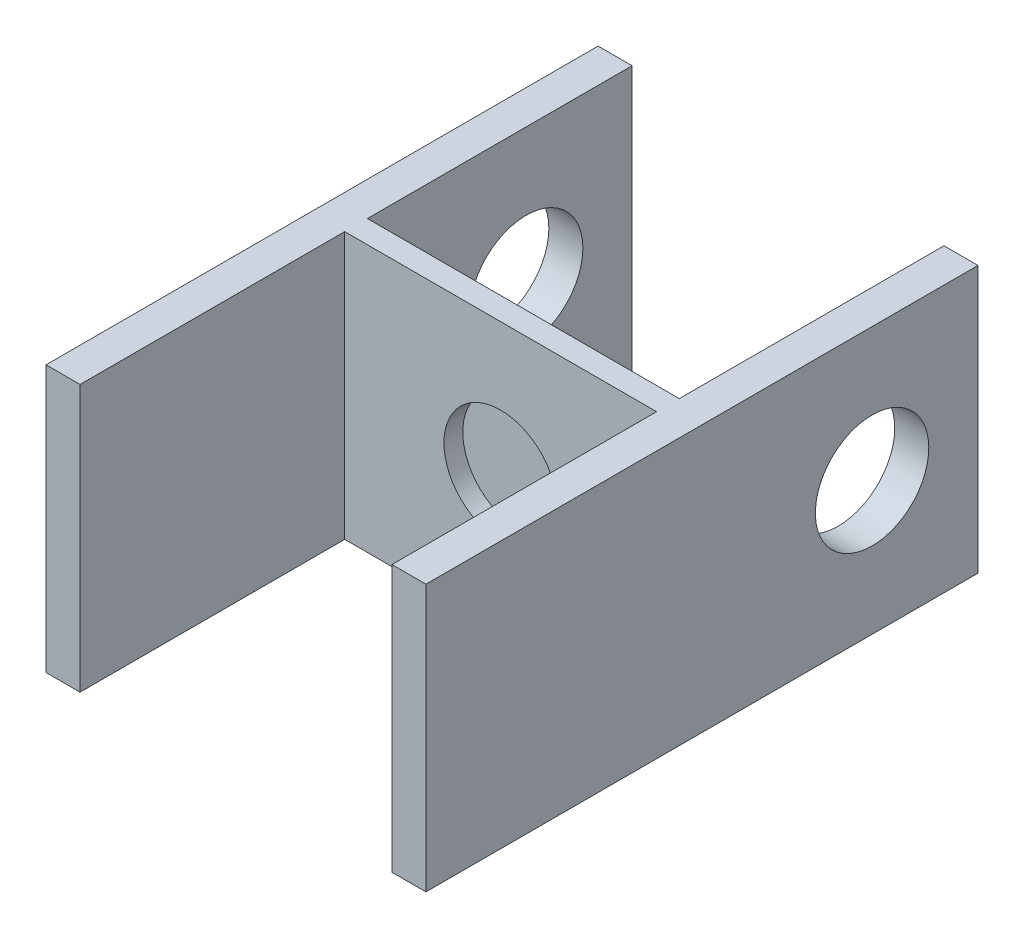
ISO-10303-21;
HEADER;
FILE_DESCRIPTION(('STEP AP214'),'2;1');
FILE_NAME('part.step','',(''),(''),'','','');
FILE_SCHEMA(('AUTOMOTIVE_DESIGN { 1 0 10303 214 1 1 1 1 }'));
ENDSEC;
DATA;
#1=APPLICATION_CONTEXT('core data for automotive mechanical design processes');
#2=APPLICATION_PROTOCOL_DEFINITION('international standard','automotive_design',2000,#1);
#3=PRODUCT_CONTEXT('',#1,'mechanical');
#4=PRODUCT('Part','Part','',(#3));
#5=PRODUCT_RELATED_PRODUCT_CATEGORY('part','',(#4));
#6=PRODUCT_DEFINITION_FORMATION('','',#4);
#7=PRODUCT_DEFINITION_CONTEXT('part definition',#1,'design');
#8=PRODUCT_DEFINITION('design','',#6,#7);
#9=PRODUCT_DEFINITION_SHAPE('','',#8);
#10=(LENGTH_UNIT() NAMED_UNIT(*) SI_UNIT(.MILLI.,.METRE.));
#11=(NAMED_UNIT(*) PLANE_ANGLE_UNIT() SI_UNIT($,.RADIAN.));
#12=(NAMED_UNIT(*) SI_UNIT($,.STERADIAN.) SOLID_ANGLE_UNIT());
#13=UNCERTAINTY_MEASURE_WITH_UNIT(LENGTH_MEASURE(1.E-05),#10,'distance_accuracy_value','');
#14=(GEOMETRIC_REPRESENTATION_CONTEXT(3) GLOBAL_UNCERTAINTY_ASSIGNED_CONTEXT((#13)) GLOBAL_UNIT_ASSIGNED_CONTEXT((#10,
#11,#12)) REPRESENTATION_CONTEXT('',''));
#15=CARTESIAN_POINT('',(0.,0.,0.));
#16=DIRECTION('',(0.,0.,1.));
#17=DIRECTION('',(1.,0.,0.));
#18=AXIS2_PLACEMENT_3D('',#15,#16,#17);
#19=CARTESIAN_POINT('',(-103.125,205.625,-180.218220147143));
#20=DIRECTION('',(0.,0.,1.));
#21=DIRECTION('',(1.,0.,0.));
#22=AXIS2_PLACEMENT_3D('',#19,#20,#21);
#23=PLANE('',#22);
#24=DIRECTION('',(-1.,0.,0.));
#25=VECTOR('',#24,1.);
#26=CARTESIAN_POINT('',(-103.125,29.375,-180.218220147143));
#27=LINE('',#26,#25);
#28=CARTESIAN_POINT('',(-103.125,29.375,-180.218220147143));
#29=VERTEX_POINT('',#28);
#30=CARTESIAN_POINT('',(-125.625,29.375,-180.218220147143));
#31=VERTEX_POINT('',#30);
#32=EDGE_CURVE('E166',#29,#31,#27,.T.);
#33=ORIENTED_EDGE('',*,*,#32,.T.);
#34=DIRECTION('',(0.,-1.,0.));
#35=VECTOR('',#34,1.);
#36=CARTESIAN_POINT('',(-125.625,205.625,-180.218220147143));
#37=LINE('',#36,#35);
#38=CARTESIAN_POINT('',(-125.625,205.625,-180.218220147143));
#39=VERTEX_POINT('',#38);
#40=EDGE_CURVE('E12',#39,#31,#37,.T.);
#41=ORIENTED_EDGE('',*,*,#40,.F.);
#42=DIRECTION('',(-1.,0.,0.));
#43=VECTOR('',#42,1.);
#44=CARTESIAN_POINT('',(-103.125,205.625,-180.218220147143));
#45=LINE('',#44,#43);
#46=CARTESIAN_POINT('',(-103.125,205.625,-180.218220147143));
#47=VERTEX_POINT('',#46);
#48=EDGE_CURVE('E194',#47,#39,#45,.T.);
#49=ORIENTED_EDGE('',*,*,#48,.F.);
#50=DIRECTION('',(0.,-1.,0.));
#51=VECTOR('',#50,1.);
#52=CARTESIAN_POINT('',(-103.125,205.625,-180.218220147143));
#53=LINE('',#52,#51);
#54=EDGE_CURVE('E164',#47,#29,#53,.T.);
#55=ORIENTED_EDGE('',*,*,#54,.T.);
#56=EDGE_LOOP('',(#33,#41,#49,#55));
#57=FACE_BOUND('',#56,.T.);
#58=ADVANCED_FACE('F48',(#57),#23,.F.);
#59=CARTESIAN_POINT('',(-125.625,205.625,184.881779852857));
#60=DIRECTION('',(1.,0.,0.));
#61=DIRECTION('',(0.,0.,-1.));
#62=AXIS2_PLACEMENT_3D('',#59,#60,#61);
#63=PLANE('',#62);
#64=CARTESIAN_POINT('',(-125.625,117.5,-110.168220147143));
#65=DIRECTION('',(1.,0.,0.));
#66=DIRECTION('',(0.,0.,-1.));
#67=AXIS2_PLACEMENT_3D('',#64,#65,#66);
#68=CIRCLE('',#67,37.5);
#69=CARTESIAN_POINT('',(-125.625,117.5,-147.668220147143));
#70=VERTEX_POINT('',#69);
#71=EDGE_CURVE('E307',#70,#70,#68,.T.);
#72=ORIENTED_EDGE('',*,*,#71,.T.);
#73=EDGE_LOOP('',(#72));
#74=FACE_BOUND('',#73,.T.);
#75=DIRECTION('',(0.,0.,1.));
#76=VECTOR('',#75,1.);
#77=CARTESIAN_POINT('',(-125.625,29.375,184.881779852857));
#78=LINE('',#77,#76);
#79=CARTESIAN_POINT('',(-125.625,29.375,184.881779852857));
#80=VERTEX_POINT('',#79);
#81=EDGE_CURVE('E174',#31,#80,#78,.T.);
#82=ORIENTED_EDGE('',*,*,#81,.T.);
#83=DIRECTION('',(0.,-1.,0.));
#84=VECTOR('',#83,1.);
#85=CARTESIAN_POINT('',(-125.625,205.625,184.881779852857));
#86=LINE('',#85,#84);
#87=CARTESIAN_POINT('',(-125.625,205.625,184.881779852857));
#88=VERTEX_POINT('',#87);
#89=EDGE_CURVE('E60',#88,#80,#86,.T.);
#90=ORIENTED_EDGE('',*,*,#89,.F.);
#91=DIRECTION('',(0.,0.,1.));
#92=VECTOR('',#91,1.);
#93=CARTESIAN_POINT('',(-125.625,205.625,184.881779852857));
#94=LINE('',#93,#92);
#95=EDGE_CURVE('E118',#39,#88,#94,.T.);
#96=ORIENTED_EDGE('',*,*,#95,.F.);
#97=ORIENTED_EDGE('',*,*,#40,.T.);
#98=EDGE_LOOP('',(#82,#90,#96,#97));
#99=FACE_BOUND('',#98,.T.);
#100=ADVANCED_FACE('F272',(#74,#99),#63,.F.);
#101=CARTESIAN_POINT('',(-103.125,205.625,184.881779852857));
#102=DIRECTION('',(0.,0.,-1.));
#103=DIRECTION('',(-1.,0.,0.));
#104=AXIS2_PLACEMENT_3D('',#101,#102,#103);
#105=PLANE('',#104);
#106=DIRECTION('',(1.,0.,0.));
#107=VECTOR('',#106,1.);
#108=CARTESIAN_POINT('',(-103.125,29.375,184.881779852857));
#109=LINE('',#108,#107);
#110=CARTESIAN_POINT('',(-103.125,29.375,184.881779852857));
#111=VERTEX_POINT('',#110);
#112=EDGE_CURVE('E173',#80,#111,#109,.T.);
#113=ORIENTED_EDGE('',*,*,#112,.T.);
#114=DIRECTION('',(0.,-1.,0.));
#115=VECTOR('',#114,1.);
#116=CARTESIAN_POINT('',(-103.125,205.625,184.881779852857));
#117=LINE('',#116,#115);
#118=CARTESIAN_POINT('',(-103.125,205.625,184.881779852857));
#119=VERTEX_POINT('',#118);
#120=EDGE_CURVE('E211',#119,#111,#117,.T.);
#121=ORIENTED_EDGE('',*,*,#120,.F.);
#122=DIRECTION('',(1.,0.,0.));
#123=VECTOR('',#122,1.);
#124=CARTESIAN_POINT('',(-103.125,205.625,184.881779852857));
#125=LINE('',#124,#123);
#126=EDGE_CURVE('E219',#88,#119,#125,.T.);
#127=ORIENTED_EDGE('',*,*,#126,.F.);
#128=ORIENTED_EDGE('',*,*,#89,.T.);
#129=EDGE_LOOP('',(#113,#121,#127,#128));
#130=FACE_BOUND('',#129,.T.);
#131=ADVANCED_FACE('F217',(#130),#105,.F.);
#132=CARTESIAN_POINT('',(-103.125,205.625,184.881779852857));
#133=DIRECTION('',(-1.,0.,0.));
#134=DIRECTION('',(0.,0.,1.));
#135=AXIS2_PLACEMENT_3D('',#132,#133,#134);
#136=PLANE('',#135);
#137=DIRECTION('',(0.,0.,-1.));
#138=VECTOR('',#137,1.);
#139=CARTESIAN_POINT('',(-103.125,29.375,184.881779852857));
#140=LINE('',#139,#138);
#141=CARTESIAN_POINT('',(-103.125,29.375,9.83177985285734));
#142=VERTEX_POINT('',#141);
#143=EDGE_CURVE('E179',#111,#142,#140,.T.);
#144=ORIENTED_EDGE('',*,*,#143,.T.);
#145=DIRECTION('',(0.,-1.,0.));
#146=VECTOR('',#145,1.);
#147=CARTESIAN_POINT('',(-103.125,205.625,9.83177985285734));
#148=LINE('',#147,#146);
#149=CARTESIAN_POINT('',(-103.125,205.625,9.83177985285734));
#150=VERTEX_POINT('',#149);
#151=EDGE_CURVE('E208',#150,#142,#148,.T.);
#152=ORIENTED_EDGE('',*,*,#151,.F.);
#153=DIRECTION('',(0.,0.,-1.));
#154=VECTOR('',#153,1.);
#155=CARTESIAN_POINT('',(-103.125,205.625,184.881779852857));
#156=LINE('',#155,#154);
#157=EDGE_CURVE('E236',#119,#150,#156,.T.);
#158=ORIENTED_EDGE('',*,*,#157,.F.);
#159=ORIENTED_EDGE('',*,*,#120,.T.);
#160=EDGE_LOOP('',(#144,#152,#158,#159));
#161=FACE_BOUND('',#160,.T.);
#162=ADVANCED_FACE('F226',(#161),#136,.F.);
#163=CARTESIAN_POINT('',(-103.125,205.625,9.83177985285734));
#164=DIRECTION('',(0.,0.,-1.));
#165=DIRECTION('',(-1.,0.,0.));
#166=AXIS2_PLACEMENT_3D('',#163,#164,#165);
#167=PLANE('',#166);
#168=CARTESIAN_POINT('',(0.,117.5,9.83177985285734));
#169=DIRECTION('',(0.,0.,1.));
#170=DIRECTION('',(1.,0.,0.));
#171=AXIS2_PLACEMENT_3D('',#168,#169,#170);
#172=CIRCLE('',#171,37.5);
#173=CARTESIAN_POINT('',(37.5,117.5,9.83177985285734));
#174=VERTEX_POINT('',#173);
#175=EDGE_CURVE('E310',#174,#174,#172,.T.);
#176=ORIENTED_EDGE('',*,*,#175,.F.);
#177=EDGE_LOOP('',(#176));
#178=FACE_BOUND('',#177,.T.);
#179=DIRECTION('',(1.,0.,0.));
#180=VECTOR('',#179,1.);
#181=CARTESIAN_POINT('',(-103.125,29.375,9.83177985285734));
#182=LINE('',#181,#180);
#183=CARTESIAN_POINT('',(103.125,29.375,9.83177985285734));
#184=VERTEX_POINT('',#183);
#185=EDGE_CURVE('E176',#142,#184,#182,.T.);
#186=ORIENTED_EDGE('',*,*,#185,.T.);
#187=DIRECTION('',(0.,-1.,0.));
#188=VECTOR('',#187,1.);
#189=CARTESIAN_POINT('',(103.125,205.625,9.83177985285734));
#190=LINE('',#189,#188);
#191=CARTESIAN_POINT('',(103.125,205.625,9.83177985285734));
#192=VERTEX_POINT('',#191);
#193=EDGE_CURVE('E202',#192,#184,#190,.T.);
#194=ORIENTED_EDGE('',*,*,#193,.F.);
#195=DIRECTION('',(1.,0.,0.));
#196=VECTOR('',#195,1.);
#197=CARTESIAN_POINT('',(-103.125,205.625,9.83177985285734));
#198=LINE('',#197,#196);
#199=EDGE_CURVE('E233',#150,#192,#198,.T.);
#200=ORIENTED_EDGE('',*,*,#199,.F.);
#201=ORIENTED_EDGE('',*,*,#151,.T.);
#202=EDGE_LOOP('',(#186,#194,#200,#201));
#203=FACE_BOUND('',#202,.T.);
#204=ADVANCED_FACE('F235',(#178,#203),#167,.F.);
#205=CARTESIAN_POINT('',(103.125,205.625,184.881779852857));
#206=DIRECTION('',(1.,0.,0.));
#207=DIRECTION('',(0.,0.,-1.));
#208=AXIS2_PLACEMENT_3D('',#205,#206,#207);
#209=PLANE('',#208);
#210=DIRECTION('',(0.,0.,1.));
#211=VECTOR('',#210,1.);
#212=CARTESIAN_POINT('',(103.125,29.375,184.881779852857));
#213=LINE('',#212,#211);
#214=CARTESIAN_POINT('',(103.125,29.375,184.881779852857));
#215=VERTEX_POINT('',#214);
#216=EDGE_CURVE('E182',#184,#215,#213,.T.);
#217=ORIENTED_EDGE('',*,*,#216,.T.);
#218=DIRECTION('',(0.,-1.,0.));
#219=VECTOR('',#218,1.);
#220=CARTESIAN_POINT('',(103.125,205.625,184.881779852857));
#221=LINE('',#220,#219);
#222=CARTESIAN_POINT('',(103.125,205.625,184.881779852857));
#223=VERTEX_POINT('',#222);
#224=EDGE_CURVE('E205',#223,#215,#221,.T.);
#225=ORIENTED_EDGE('',*,*,#224,.F.);
#226=DIRECTION('',(0.,0.,1.));
#227=VECTOR('',#226,1.);
#228=CARTESIAN_POINT('',(103.125,205.625,184.881779852857));
#229=LINE('',#228,#227);
#230=EDGE_CURVE('E240',#192,#223,#229,.T.);
#231=ORIENTED_EDGE('',*,*,#230,.F.);
#232=ORIENTED_EDGE('',*,*,#193,.T.);
#233=EDGE_LOOP('',(#217,#225,#231,#232));
#234=FACE_BOUND('',#233,.T.);
#235=ADVANCED_FACE('F283',(#234),#209,.F.);
#236=CARTESIAN_POINT('',(125.625,205.625,184.881779852857));
#237=DIRECTION('',(0.,0.,-1.));
#238=DIRECTION('',(-1.,0.,0.));
#239=AXIS2_PLACEMENT_3D('',#236,#237,#238);
#240=PLANE('',#239);
#241=DIRECTION('',(1.,0.,0.));
#242=VECTOR('',#241,1.);
#243=CARTESIAN_POINT('',(125.625,29.375,184.881779852857));
#244=LINE('',#243,#242);
#245=CARTESIAN_POINT('',(125.625,29.375,184.881779852857));
#246=VERTEX_POINT('',#245);
#247=EDGE_CURVE('E181',#215,#246,#244,.T.);
#248=ORIENTED_EDGE('',*,*,#247,.T.);
#249=DIRECTION('',(0.,-1.,0.));
#250=VECTOR('',#249,1.);
#251=CARTESIAN_POINT('',(125.625,205.625,184.881779852857));
#252=LINE('',#251,#250);
#253=CARTESIAN_POINT('',(125.625,205.625,184.881779852857));
#254=VERTEX_POINT('',#253);
#255=EDGE_CURVE('E200',#254,#246,#252,.T.);
#256=ORIENTED_EDGE('',*,*,#255,.F.);
#257=DIRECTION('',(1.,0.,0.));
#258=VECTOR('',#257,1.);
#259=CARTESIAN_POINT('',(125.625,205.625,184.881779852857));
#260=LINE('',#259,#258);
#261=EDGE_CURVE('E238',#223,#254,#260,.T.);
#262=ORIENTED_EDGE('',*,*,#261,.F.);
#263=ORIENTED_EDGE('',*,*,#224,.T.);
#264=EDGE_LOOP('',(#248,#256,#262,#263));
#265=FACE_BOUND('',#264,.T.);
#266=ADVANCED_FACE('F286',(#265),#240,.F.);
#267=CARTESIAN_POINT('',(125.625,205.625,184.881779852857));
#268=DIRECTION('',(-1.,0.,0.));
#269=DIRECTION('',(0.,0.,1.));
#270=AXIS2_PLACEMENT_3D('',#267,#268,#269);
#271=PLANE('',#270);
#272=CARTESIAN_POINT('',(125.625,117.5,-110.168220147143));
#273=DIRECTION('',(1.,0.,0.));
#274=DIRECTION('',(0.,0.,-1.));
#275=AXIS2_PLACEMENT_3D('',#272,#273,#274);
#276=CIRCLE('',#275,37.5);
#277=CARTESIAN_POINT('',(125.625,117.5,-147.668220147143));
#278=VERTEX_POINT('',#277);
#279=EDGE_CURVE('E313',#278,#278,#276,.T.);
#280=ORIENTED_EDGE('',*,*,#279,.F.);
#281=EDGE_LOOP('',(#280));
#282=FACE_BOUND('',#281,.T.);
#283=DIRECTION('',(0.,0.,-1.));
#284=VECTOR('',#283,1.);
#285=CARTESIAN_POINT('',(125.625,29.375,184.881779852857));
#286=LINE('',#285,#284);
#287=CARTESIAN_POINT('',(125.625,29.375,-180.218220147143));
#288=VERTEX_POINT('',#287);
#289=EDGE_CURVE('E183',#246,#288,#286,.T.);
#290=ORIENTED_EDGE('',*,*,#289,.T.);
#291=DIRECTION('',(0.,-1.,0.));
#292=VECTOR('',#291,1.);
#293=CARTESIAN_POINT('',(125.625,205.625,-180.218220147143));
#294=LINE('',#293,#292);
#295=CARTESIAN_POINT('',(125.625,205.625,-180.218220147143));
#296=VERTEX_POINT('',#295);
#297=EDGE_CURVE('E198',#296,#288,#294,.T.);
#298=ORIENTED_EDGE('',*,*,#297,.F.);
#299=DIRECTION('',(0.,0.,-1.));
#300=VECTOR('',#299,1.);
#301=CARTESIAN_POINT('',(125.625,205.625,184.881779852857));
#302=LINE('',#301,#300);
#303=EDGE_CURVE('E247',#254,#296,#302,.T.);
#304=ORIENTED_EDGE('',*,*,#303,.F.);
#305=ORIENTED_EDGE('',*,*,#255,.T.);
#306=EDGE_LOOP('',(#290,#298,#304,#305));
#307=FACE_BOUND('',#306,.T.);
#308=ADVANCED_FACE('F252',(#282,#307),#271,.F.);
#309=CARTESIAN_POINT('',(125.625,205.625,-180.218220147143));
#310=DIRECTION('',(0.,0.,1.));
#311=DIRECTION('',(1.,0.,0.));
#312=AXIS2_PLACEMENT_3D('',#309,#310,#311);
#313=PLANE('',#312);
#314=DIRECTION('',(-1.,0.,0.));
#315=VECTOR('',#314,1.);
#316=CARTESIAN_POINT('',(125.625,29.375,-180.218220147143));
#317=LINE('',#316,#315);
#318=CARTESIAN_POINT('',(103.125,29.375,-180.218220147143));
#319=VERTEX_POINT('',#318);
#320=EDGE_CURVE('E189',#288,#319,#317,.T.);
#321=ORIENTED_EDGE('',*,*,#320,.T.);
#322=DIRECTION('',(0.,-1.,0.));
#323=VECTOR('',#322,1.);
#324=CARTESIAN_POINT('',(103.125,205.625,-180.218220147143));
#325=LINE('',#324,#323);
#326=CARTESIAN_POINT('',(103.125,205.625,-180.218220147143));
#327=VERTEX_POINT('',#326);
#328=EDGE_CURVE('E159',#327,#319,#325,.T.);
#329=ORIENTED_EDGE('',*,*,#328,.F.);
#330=DIRECTION('',(-1.,0.,0.));
#331=VECTOR('',#330,1.);
#332=CARTESIAN_POINT('',(125.625,205.625,-180.218220147143));
#333=LINE('',#332,#331);
#334=EDGE_CURVE('E151',#296,#327,#333,.T.);
#335=ORIENTED_EDGE('',*,*,#334,.F.);
#336=ORIENTED_EDGE('',*,*,#297,.T.);
#337=EDGE_LOOP('',(#321,#329,#335,#336));
#338=FACE_BOUND('',#337,.T.);
#339=ADVANCED_FACE('F258',(#338),#313,.F.);
#340=CARTESIAN_POINT('',(103.125,205.625,-180.218220147143));
#341=DIRECTION('',(1.,0.,0.));
#342=DIRECTION('',(0.,0.,-1.));
#343=AXIS2_PLACEMENT_3D('',#340,#341,#342);
#344=PLANE('',#343);
#345=CARTESIAN_POINT('',(103.125,117.5,-110.168220147143));
#346=DIRECTION('',(1.,0.,0.));
#347=DIRECTION('',(0.,0.,-1.));
#348=AXIS2_PLACEMENT_3D('',#345,#346,#347);
#349=CIRCLE('',#348,37.5);
#350=CARTESIAN_POINT('',(103.125,117.5,-147.668220147143));
#351=VERTEX_POINT('',#350);
#352=EDGE_CURVE('E303',#351,#351,#349,.T.);
#353=ORIENTED_EDGE('',*,*,#352,.T.);
#354=EDGE_LOOP('',(#353));
#355=FACE_BOUND('',#354,.T.);
#356=DIRECTION('',(0.,0.,1.));
#357=VECTOR('',#356,1.);
#358=CARTESIAN_POINT('',(103.125,29.375,-180.218220147143));
#359=LINE('',#358,#357);
#360=CARTESIAN_POINT('',(103.125,29.375,-5.16822014714266));
#361=VERTEX_POINT('',#360);
#362=EDGE_CURVE('E157',#319,#361,#359,.T.);
#363=ORIENTED_EDGE('',*,*,#362,.T.);
#364=DIRECTION('',(0.,-1.,0.));
#365=VECTOR('',#364,1.);
#366=CARTESIAN_POINT('',(103.125,205.625,-5.16822014714266));
#367=LINE('',#366,#365);
#368=CARTESIAN_POINT('',(103.125,205.625,-5.16822014714266));
#369=VERTEX_POINT('',#368);
#370=EDGE_CURVE('E156',#369,#361,#367,.T.);
#371=ORIENTED_EDGE('',*,*,#370,.F.);
#372=DIRECTION('',(0.,0.,1.));
#373=VECTOR('',#372,1.);
#374=CARTESIAN_POINT('',(103.125,205.625,-180.218220147143));
#375=LINE('',#374,#373);
#376=EDGE_CURVE('E144',#327,#369,#375,.T.);
#377=ORIENTED_EDGE('',*,*,#376,.F.);
#378=ORIENTED_EDGE('',*,*,#328,.T.);
#379=EDGE_LOOP('',(#363,#371,#377,#378));
#380=FACE_BOUND('',#379,.T.);
#381=ADVANCED_FACE('F160',(#355,#380),#344,.F.);
#382=CARTESIAN_POINT('',(-103.125,205.625,-5.16822014714266));
#383=DIRECTION('',(0.,0.,1.));
#384=DIRECTION('',(1.,0.,0.));
#385=AXIS2_PLACEMENT_3D('',#382,#383,#384);
#386=PLANE('',#385);
#387=DIRECTION('',(-1.,0.,0.));
#388=VECTOR('',#387,1.);
#389=CARTESIAN_POINT('',(-103.125,29.375,-5.16822014714266));
#390=LINE('',#389,#388);
#391=CARTESIAN_POINT('',(-103.125,29.375,-5.16822014714266));
#392=VERTEX_POINT('',#391);
#393=EDGE_CURVE('E106',#361,#392,#390,.T.);
#394=ORIENTED_EDGE('',*,*,#393,.T.);
#395=DIRECTION('',(0.,-1.,0.));
#396=VECTOR('',#395,1.);
#397=CARTESIAN_POINT('',(-103.125,205.625,-5.16822014714266));
#398=LINE('',#397,#396);
#399=CARTESIAN_POINT('',(-103.125,205.625,-5.16822014714266));
#400=VERTEX_POINT('',#399);
#401=EDGE_CURVE('E161',#400,#392,#398,.T.);
#402=ORIENTED_EDGE('',*,*,#401,.F.);
#403=DIRECTION('',(-1.,0.,0.));
#404=VECTOR('',#403,1.);
#405=CARTESIAN_POINT('',(-103.125,205.625,-5.16822014714266));
#406=LINE('',#405,#404);
#407=EDGE_CURVE('E149',#369,#400,#406,.T.);
#408=ORIENTED_EDGE('',*,*,#407,.F.);
#409=ORIENTED_EDGE('',*,*,#370,.T.);
#410=EDGE_LOOP('',(#394,#402,#408,#409));
#411=FACE_BOUND('',#410,.T.);
#412=ADVANCED_FACE('F162',(#411),#386,.F.);
#413=CARTESIAN_POINT('',(-103.125,205.625,-180.218220147143));
#414=DIRECTION('',(-1.,0.,0.));
#415=DIRECTION('',(0.,0.,1.));
#416=AXIS2_PLACEMENT_3D('',#413,#414,#415);
#417=PLANE('',#416);
#418=CARTESIAN_POINT('',(-103.125,117.5,-110.168220147143));
#419=DIRECTION('',(-1.,0.,0.));
#420=DIRECTION('',(0.,0.,1.));
#421=AXIS2_PLACEMENT_3D('',#418,#419,#420);
#422=CIRCLE('',#421,37.5);
#423=CARTESIAN_POINT('',(-103.125,117.5,-147.668220147143));
#424=VERTEX_POINT('',#423);
#425=EDGE_CURVE('E51',#424,#424,#422,.T.);
#426=ORIENTED_EDGE('',*,*,#425,.T.);
#427=EDGE_LOOP('',(#426));
#428=FACE_BOUND('',#427,.T.);
#429=DIRECTION('',(0.,0.,-1.));
#430=VECTOR('',#429,1.);
#431=CARTESIAN_POINT('',(-103.125,29.375,-180.218220147143));
#432=LINE('',#431,#430);
#433=EDGE_CURVE('E115',#392,#29,#432,.T.);
#434=ORIENTED_EDGE('',*,*,#433,.T.);
#435=ORIENTED_EDGE('',*,*,#54,.F.);
#436=DIRECTION('',(0.,0.,-1.));
#437=VECTOR('',#436,1.);
#438=CARTESIAN_POINT('',(-103.125,205.625,-180.218220147143));
#439=LINE('',#438,#437);
#440=EDGE_CURVE('E63',#400,#47,#439,.T.);
#441=ORIENTED_EDGE('',*,*,#440,.F.);
#442=ORIENTED_EDGE('',*,*,#401,.T.);
#443=EDGE_LOOP('',(#434,#435,#441,#442));
#444=FACE_BOUND('',#443,.T.);
#445=ADVANCED_FACE('F257',(#428,#444),#417,.F.);
#446=CARTESIAN_POINT('',(0.,205.625,2.33177985285729));
#447=DIRECTION('',(0.,-1.,0.));
#448=DIRECTION('',(0.,0.,-1.));
#449=AXIS2_PLACEMENT_3D('',#446,#447,#448);
#450=PLANE('',#449);
#451=ORIENTED_EDGE('',*,*,#48,.T.);
#452=ORIENTED_EDGE('',*,*,#95,.T.);
#453=ORIENTED_EDGE('',*,*,#126,.T.);
#454=ORIENTED_EDGE('',*,*,#157,.T.);
#455=ORIENTED_EDGE('',*,*,#199,.T.);
#456=ORIENTED_EDGE('',*,*,#230,.T.);
#457=ORIENTED_EDGE('',*,*,#261,.T.);
#458=ORIENTED_EDGE('',*,*,#303,.T.);
#459=ORIENTED_EDGE('',*,*,#334,.T.);
#460=ORIENTED_EDGE('',*,*,#376,.T.);
#461=ORIENTED_EDGE('',*,*,#407,.T.);
#462=ORIENTED_EDGE('',*,*,#440,.T.);
#463=EDGE_LOOP('',(#451,#452,#453,#454,#455,#456,#457,#458,#459,#460,#461,#462));
#464=FACE_BOUND('',#463,.T.);
#465=ADVANCED_FACE('F150',(#464),#450,.F.);
#466=CARTESIAN_POINT('',(0.,29.375,2.33177985285729));
#467=DIRECTION('',(0.,-1.,0.));
#468=DIRECTION('',(0.,0.,-1.));
#469=AXIS2_PLACEMENT_3D('',#466,#467,#468);
#470=PLANE('',#469);
#471=ORIENTED_EDGE('',*,*,#32,.F.);
#472=ORIENTED_EDGE('',*,*,#433,.F.);
#473=ORIENTED_EDGE('',*,*,#393,.F.);
#474=ORIENTED_EDGE('',*,*,#362,.F.);
#475=ORIENTED_EDGE('',*,*,#320,.F.);
#476=ORIENTED_EDGE('',*,*,#289,.F.);
#477=ORIENTED_EDGE('',*,*,#247,.F.);
#478=ORIENTED_EDGE('',*,*,#216,.F.);
#479=ORIENTED_EDGE('',*,*,#185,.F.);
#480=ORIENTED_EDGE('',*,*,#143,.F.);
#481=ORIENTED_EDGE('',*,*,#112,.F.);
#482=ORIENTED_EDGE('',*,*,#81,.F.);
#483=EDGE_LOOP('',(#471,#472,#473,#474,#475,#476,#477,#478,#479,#480,#481,#482));
#484=FACE_BOUND('',#483,.T.);
#485=ADVANCED_FACE('F221',(#484),#470,.T.);
#486=CARTESIAN_POINT('',(0.,117.5,-2.61822014714266));
#487=DIRECTION('',(0.,0.,1.));
#488=DIRECTION('',(1.,0.,0.));
#489=AXIS2_PLACEMENT_3D('',#486,#487,#488);
#490=CYLINDRICAL_SURFACE('',#489,37.5);
#491=CARTESIAN_POINT('',(0.,117.5,-2.61822014714266));
#492=DIRECTION('',(0.,0.,1.));
#493=DIRECTION('',(1.,0.,0.));
#494=AXIS2_PLACEMENT_3D('',#491,#492,#493);
#495=CIRCLE('',#494,37.5);
#496=CARTESIAN_POINT('',(37.5,117.5,-2.61822014714266));
#497=VERTEX_POINT('',#496);
#498=EDGE_CURVE('E175',#497,#497,#495,.T.);
#499=CARTESIAN_POINT('',(37.5,117.5,-2.61822014714266));
#500=CARTESIAN_POINT('',(37.5,117.5,-2.48853264714266));
#501=CARTESIAN_POINT('',(37.5,117.5,-2.35884514714266));
#502=CARTESIAN_POINT('',(37.5,117.5,-2.09947014714266));
#503=CARTESIAN_POINT('',(37.5,117.5,-1.96978264714266));
#504=CARTESIAN_POINT('',(37.5,117.5,-1.71040764714266));
#505=CARTESIAN_POINT('',(37.5,117.5,-1.58072014714266));
#506=CARTESIAN_POINT('',(37.5,117.5,-1.32134514714266));
#507=CARTESIAN_POINT('',(37.5,117.5,-1.19165764714266));
#508=CARTESIAN_POINT('',(37.5,117.5,-0.932282647142658));
#509=CARTESIAN_POINT('',(37.5,117.5,-0.802595147142658));
#510=CARTESIAN_POINT('',(37.5,117.5,-0.543220147142659));
#511=CARTESIAN_POINT('',(37.5,117.5,-0.413532647142659));
#512=CARTESIAN_POINT('',(37.5,117.5,-0.154157647142659));
#513=CARTESIAN_POINT('',(37.5,117.5,-0.0244701471426587));
#514=CARTESIAN_POINT('',(37.5,117.5,0.234904852857341));
#515=CARTESIAN_POINT('',(37.5,117.5,0.364592352857341));
#516=CARTESIAN_POINT('',(37.5,117.5,0.623967352857341));
#517=CARTESIAN_POINT('',(37.5,117.5,0.753654852857341));
#518=CARTESIAN_POINT('',(37.5,117.5,1.01302985285734));
#519=CARTESIAN_POINT('',(37.5,117.5,1.14271735285734));
#520=CARTESIAN_POINT('',(37.5,117.5,1.40209235285734));
#521=CARTESIAN_POINT('',(37.5,117.5,1.53177985285734));
#522=CARTESIAN_POINT('',(37.5,117.5,1.79115485285734));
#523=CARTESIAN_POINT('',(37.5,117.5,1.92084235285734));
#524=CARTESIAN_POINT('',(37.5,117.5,2.18021735285734));
#525=CARTESIAN_POINT('',(37.5,117.5,2.30990485285734));
#526=CARTESIAN_POINT('',(37.5,117.5,2.56927985285734));
#527=CARTESIAN_POINT('',(37.5,117.5,2.69896735285734));
#528=CARTESIAN_POINT('',(37.5,117.5,2.95834235285734));
#529=CARTESIAN_POINT('',(37.5,117.5,3.08802985285734));
#530=CARTESIAN_POINT('',(37.5,117.5,3.34740485285734));
#531=CARTESIAN_POINT('',(37.5,117.5,3.47709235285734));
#532=CARTESIAN_POINT('',(37.5,117.5,3.73646735285734));
#533=CARTESIAN_POINT('',(37.5,117.5,3.86615485285734));
#534=CARTESIAN_POINT('',(37.5,117.5,4.12552985285734));
#535=CARTESIAN_POINT('',(37.5,117.5,4.25521735285734));
#536=CARTESIAN_POINT('',(37.5,117.5,4.51459235285734));
#537=CARTESIAN_POINT('',(37.5,117.5,4.64427985285734));
#538=CARTESIAN_POINT('',(37.5,117.5,4.90365485285734));
#539=CARTESIAN_POINT('',(37.5,117.5,5.03334235285734));
#540=CARTESIAN_POINT('',(37.5,117.5,5.29271735285734));
#541=CARTESIAN_POINT('',(37.5,117.5,5.42240485285734));
#542=CARTESIAN_POINT('',(37.5,117.5,5.68177985285734));
#543=CARTESIAN_POINT('',(37.5,117.5,5.81146735285734));
#544=CARTESIAN_POINT('',(37.5,117.5,6.07084235285734));
#545=CARTESIAN_POINT('',(37.5,117.5,6.20052985285734));
#546=CARTESIAN_POINT('',(37.5,117.5,6.45990485285734));
#547=CARTESIAN_POINT('',(37.5,117.5,6.58959235285734));
#548=CARTESIAN_POINT('',(37.5,117.5,6.84896735285734));
#549=CARTESIAN_POINT('',(37.5,117.5,6.97865485285734));
#550=CARTESIAN_POINT('',(37.5,117.5,7.23802985285734));
#551=CARTESIAN_POINT('',(37.5,117.5,7.36771735285734));
#552=CARTESIAN_POINT('',(37.5,117.5,7.62709235285734));
#553=CARTESIAN_POINT('',(37.5,117.5,7.75677985285734));
#554=CARTESIAN_POINT('',(37.5,117.5,8.01615485285734));
#555=CARTESIAN_POINT('',(37.5,117.5,8.14584235285734));
#556=CARTESIAN_POINT('',(37.5,117.5,8.40521735285734));
#557=CARTESIAN_POINT('',(37.5,117.5,8.53490485285734));
#558=CARTESIAN_POINT('',(37.5,117.5,8.79427985285734));
#559=CARTESIAN_POINT('',(37.5,117.5,8.92396735285734));
#560=CARTESIAN_POINT('',(37.5,117.5,9.18334235285734));
#561=CARTESIAN_POINT('',(37.5,117.5,9.31302985285734));
#562=CARTESIAN_POINT('',(37.5,117.5,9.57240485285734));
#563=CARTESIAN_POINT('',(37.5,117.5,9.70209235285734));
#564=CARTESIAN_POINT('',(37.5,117.5,9.83177985285734));
#565=B_SPLINE_CURVE_WITH_KNOTS('',3,(#499,#500,#501,#502,#503,#504,#505,#506,#507,#508,#509,
#510,#511,#512,#513,#514,#515,#516,#517,#518,#519,#520,#521,#522,#523,#524,#525,#526,#527,#528,
#529,#530,#531,#532,#533,#534,#535,#536,#537,#538,#539,#540,#541,#542,#543,#544,#545,#546,#547,
#548,#549,#550,#551,#552,#553,#554,#555,#556,#557,#558,#559,#560,#561,#562,#563,#564),
.UNSPECIFIED.,.F.,.F.,(4,2,2,2,2,2,2,2,2,2,2,2,2,2,2,2,2,2,2,2,2,2,2,2,2,2,2,2,2,2,2,2,4),(0.,
0.3890625,0.778125,1.1671875,1.55625,1.9453125,2.334375,2.7234375,3.1125,3.5015625,3.890625,
4.2796875,4.66875,5.0578125,5.446875,5.8359375,6.225,6.6140625,7.003125,7.3921875,7.78125,
8.1703125,8.559375,8.9484375,9.3375,9.7265625,10.115625,10.5046875,10.89375,11.2828125,
11.671875,12.0609375,12.45),.UNSPECIFIED.);
#566=EDGE_CURVE('BSEAM321',#497,#174,#565,.T.);
#567=ORIENTED_EDGE('',*,*,#498,.F.);
#568=ORIENTED_EDGE('',*,*,#175,.T.);
#569=ORIENTED_EDGE('',*,*,#566,.T.);
#570=ORIENTED_EDGE('',*,*,#566,.F.);
#571=EDGE_LOOP('',(#567,#569,#568,#570));
#572=FACE_BOUND('',#571,.T.);
#573=ADVANCED_FACE('F321',(#572),#490,.F.);
#574=CARTESIAN_POINT('',(0.,117.5,-2.61822014714266));
#575=DIRECTION('',(0.,0.,1.));
#576=DIRECTION('',(1.,0.,0.));
#577=AXIS2_PLACEMENT_3D('',#574,#575,#576);
#578=PLANE('',#577);
#579=ORIENTED_EDGE('',*,*,#498,.T.);
#580=EDGE_LOOP('',(#579));
#581=FACE_BOUND('',#580,.T.);
#582=ADVANCED_FACE('F323',(#581),#578,.T.);
#583=CARTESIAN_POINT('',(-375.075,117.5,-110.168220147143));
#584=DIRECTION('',(1.,0.,0.));
#585=DIRECTION('',(0.,0.,-1.));
#586=AXIS2_PLACEMENT_3D('',#583,#584,#585);
#587=CYLINDRICAL_SURFACE('',#586,37.5);
#588=CARTESIAN_POINT('',(-103.125,117.5,-147.668220147143));
#589=CARTESIAN_POINT('',(-103.359375,117.5,-147.668220147143));
#590=CARTESIAN_POINT('',(-103.59375,117.5,-147.668220147143));
#591=CARTESIAN_POINT('',(-104.0625,117.5,-147.668220147143));
#592=CARTESIAN_POINT('',(-104.296875,117.5,-147.668220147143));
#593=CARTESIAN_POINT('',(-104.765625,117.5,-147.668220147143));
#594=CARTESIAN_POINT('',(-105.,117.5,-147.668220147143));
#595=CARTESIAN_POINT('',(-105.46875,117.5,-147.668220147143));
#596=CARTESIAN_POINT('',(-105.703125,117.5,-147.668220147143));
#597=CARTESIAN_POINT('',(-106.171875,117.5,-147.668220147143));
#598=CARTESIAN_POINT('',(-106.40625,117.5,-147.668220147143));
#599=CARTESIAN_POINT('',(-106.875,117.5,-147.668220147143));
#600=CARTESIAN_POINT('',(-107.109375,117.5,-147.668220147143));
#601=CARTESIAN_POINT('',(-107.578125,117.5,-147.668220147143));
#602=CARTESIAN_POINT('',(-107.8125,117.5,-147.668220147143));
#603=CARTESIAN_POINT('',(-108.28125,117.5,-147.668220147143));
#604=CARTESIAN_POINT('',(-108.515625,117.5,-147.668220147143));
#605=CARTESIAN_POINT('',(-108.984375,117.5,-147.668220147143));
#606=CARTESIAN_POINT('',(-109.21875,117.5,-147.668220147143));
#607=CARTESIAN_POINT('',(-109.6875,117.5,-147.668220147143));
#608=CARTESIAN_POINT('',(-109.921875,117.5,-147.668220147143));
#609=CARTESIAN_POINT('',(-110.390625,117.5,-147.668220147143));
#610=CARTESIAN_POINT('',(-110.625,117.5,-147.668220147143));
#611=CARTESIAN_POINT('',(-111.09375,117.5,-147.668220147143));
#612=CARTESIAN_POINT('',(-111.328125,117.5,-147.668220147143));
#613=CARTESIAN_POINT('',(-111.796875,117.5,-147.668220147143));
#614=CARTESIAN_POINT('',(-112.03125,117.5,-147.668220147143));
#615=CARTESIAN_POINT('',(-112.5,117.5,-147.668220147143));
#616=CARTESIAN_POINT('',(-112.734375,117.5,-147.668220147143));
#617=CARTESIAN_POINT('',(-113.203125,117.5,-147.668220147143));
#618=CARTESIAN_POINT('',(-113.4375,117.5,-147.668220147143));
#619=CARTESIAN_POINT('',(-113.90625,117.5,-147.668220147143));
#620=CARTESIAN_POINT('',(-114.140625,117.5,-147.668220147143));
#621=CARTESIAN_POINT('',(-114.609375,117.5,-147.668220147143));
#622=CARTESIAN_POINT('',(-114.84375,117.5,-147.668220147143));
#623=CARTESIAN_POINT('',(-115.3125,117.5,-147.668220147143));
#624=CARTESIAN_POINT('',(-115.546875,117.5,-147.668220147143));
#625=CARTESIAN_POINT('',(-116.015625,117.5,-147.668220147143));
#626=CARTESIAN_POINT('',(-116.25,117.5,-147.668220147143));
#627=CARTESIAN_POINT('',(-116.71875,117.5,-147.668220147143));
#628=CARTESIAN_POINT('',(-116.953125,117.5,-147.668220147143));
#629=CARTESIAN_POINT('',(-117.421875,117.5,-147.668220147143));
#630=CARTESIAN_POINT('',(-117.65625,117.5,-147.668220147143));
#631=CARTESIAN_POINT('',(-118.125,117.5,-147.668220147143));
#632=CARTESIAN_POINT('',(-118.359375,117.5,-147.668220147143));
#633=CARTESIAN_POINT('',(-118.828125,117.5,-147.668220147143));
#634=CARTESIAN_POINT('',(-119.0625,117.5,-147.668220147143));
#635=CARTESIAN_POINT('',(-119.53125,117.5,-147.668220147143));
#636=CARTESIAN_POINT('',(-119.765625,117.5,-147.668220147143));
#637=CARTESIAN_POINT('',(-120.234375,117.5,-147.668220147143));
#638=CARTESIAN_POINT('',(-120.46875,117.5,-147.668220147143));
#639=CARTESIAN_POINT('',(-120.9375,117.5,-147.668220147143));
#640=CARTESIAN_POINT('',(-121.171875,117.5,-147.668220147143));
#641=CARTESIAN_POINT('',(-121.640625,117.5,-147.668220147143));
#642=CARTESIAN_POINT('',(-121.875,117.5,-147.668220147143));
#643=CARTESIAN_POINT('',(-122.34375,117.5,-147.668220147143));
#644=CARTESIAN_POINT('',(-122.578125,117.5,-147.668220147143));
#645=CARTESIAN_POINT('',(-123.046875,117.5,-147.668220147143));
#646=CARTESIAN_POINT('',(-123.28125,117.5,-147.668220147143));
#647=CARTESIAN_POINT('',(-123.75,117.5,-147.668220147143));
#648=CARTESIAN_POINT('',(-123.984375,117.5,-147.668220147143));
#649=CARTESIAN_POINT('',(-124.453125,117.5,-147.668220147143));
#650=CARTESIAN_POINT('',(-124.6875,117.5,-147.668220147143));
#651=CARTESIAN_POINT('',(-125.15625,117.5,-147.668220147143));
#652=CARTESIAN_POINT('',(-125.390625,117.5,-147.668220147143));
#653=CARTESIAN_POINT('',(-125.625,117.5,-147.668220147143));
#654=B_SPLINE_CURVE_WITH_KNOTS('',3,(#588,#589,#590,#591,#592,#593,#594,#595,#596,#597,#598,
#599,#600,#601,#602,#603,#604,#605,#606,#607,#608,#609,#610,#611,#612,#613,#614,#615,#616,#617,
#618,#619,#620,#621,#622,#623,#624,#625,#626,#627,#628,#629,#630,#631,#632,#633,#634,#635,#636,
#637,#638,#639,#640,#641,#642,#643,#644,#645,#646,#647,#648,#649,#650,#651,#652,#653),
.UNSPECIFIED.,.F.,.F.,(4,2,2,2,2,2,2,2,2,2,2,2,2,2,2,2,2,2,2,2,2,2,2,2,2,2,2,2,2,2,2,2,4),(0.,
0.703125000000027,1.40625,2.10937500000002,2.8125,3.51562500000002,4.21874999999999,
4.92187500000002,5.62499999999999,6.32812500000002,7.03125000000004,7.73437500000002,
8.43750000000004,9.14062500000001,9.84375000000004,10.546875,11.25,11.9531250000001,12.65625,
13.3593750000001,14.0625,14.7656250000001,15.46875,16.1718750000001,16.8750000000001,
17.5781250000001,18.2812500000001,18.9843750000001,19.6875000000001,20.390625,21.0937500000001,
21.796875,22.5000000000001),.UNSPECIFIED.);
#655=EDGE_CURVE('BSEAM328',#424,#70,#654,.T.);
#656=ORIENTED_EDGE('',*,*,#425,.F.);
#657=ORIENTED_EDGE('',*,*,#71,.F.);
#658=ORIENTED_EDGE('',*,*,#655,.T.);
#659=ORIENTED_EDGE('',*,*,#655,.F.);
#660=EDGE_LOOP('',(#656,#658,#657,#659));
#661=FACE_BOUND('',#660,.T.);
#662=ADVANCED_FACE('F328',(#661),#587,.F.);
#663=ORIENTED_EDGE('',*,*,#279,.T.);
#664=EDGE_LOOP('',(#663));
#665=FACE_BOUND('',#664,.T.);
#666=ORIENTED_EDGE('',*,*,#352,.F.);
#667=EDGE_LOOP('',(#666));
#668=FACE_BOUND('',#667,.T.);
#669=ADVANCED_FACE('F333',(#665,#668),#587,.F.);
#670=CLOSED_SHELL('',(#58,#100,#131,#162,#204,#235,#266,#308,#339,#381,#412,#445,#465,#485,#573,
#582,#662,#669));
#671=MANIFOLD_SOLID_BREP('B2',#670);
#672=ADVANCED_BREP_SHAPE_REPRESENTATION('',(#18,#671),#14);
#673=SHAPE_DEFINITION_REPRESENTATION(#9,#672);
ENDSEC;
END-ISO-10303-21;
